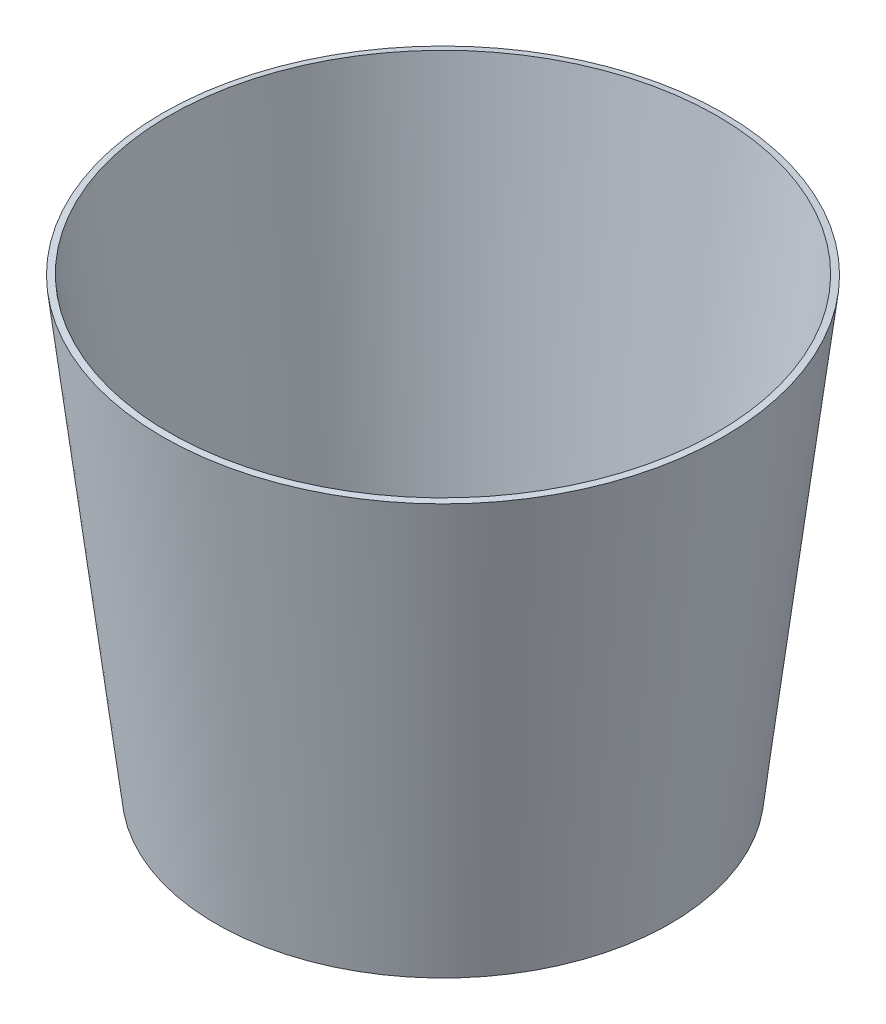
ISO-10303-21;
HEADER;
FILE_DESCRIPTION(('STEP AP214'),'2;1');
FILE_NAME('part.step','',(''),(''),'','','');
FILE_SCHEMA(('AUTOMOTIVE_DESIGN { 1 0 10303 214 1 1 1 1 }'));
ENDSEC;
DATA;
#1=APPLICATION_CONTEXT('core data for automotive mechanical design processes');
#2=APPLICATION_PROTOCOL_DEFINITION('international standard','automotive_design',2000,#1);
#3=PRODUCT_CONTEXT('',#1,'mechanical');
#4=PRODUCT('Part','Part','',(#3));
#5=PRODUCT_RELATED_PRODUCT_CATEGORY('part','',(#4));
#6=PRODUCT_DEFINITION_FORMATION('','',#4);
#7=PRODUCT_DEFINITION_CONTEXT('part definition',#1,'design');
#8=PRODUCT_DEFINITION('design','',#6,#7);
#9=PRODUCT_DEFINITION_SHAPE('','',#8);
#10=(LENGTH_UNIT() NAMED_UNIT(*) SI_UNIT(.MILLI.,.METRE.));
#11=(NAMED_UNIT(*) PLANE_ANGLE_UNIT() SI_UNIT($,.RADIAN.));
#12=(NAMED_UNIT(*) SI_UNIT($,.STERADIAN.) SOLID_ANGLE_UNIT());
#13=UNCERTAINTY_MEASURE_WITH_UNIT(LENGTH_MEASURE(1.E-05),#10,'distance_accuracy_value','');
#14=(GEOMETRIC_REPRESENTATION_CONTEXT(3) GLOBAL_UNCERTAINTY_ASSIGNED_CONTEXT((#13)) GLOBAL_UNIT_ASSIGNED_CONTEXT((#10,
#11,#12)) REPRESENTATION_CONTEXT('',''));
#15=CARTESIAN_POINT('',(0.,0.,0.));
#16=DIRECTION('',(0.,0.,1.));
#17=DIRECTION('',(1.,0.,0.));
#18=AXIS2_PLACEMENT_3D('',#15,#16,#17);
#19=CARTESIAN_POINT('',(0.,3.,0.));
#20=DIRECTION('',(0.,1.,0.));
#21=DIRECTION('',(0.,0.,1.));
#22=AXIS2_PLACEMENT_3D('',#19,#20,#21);
#23=PLANE('',#22);
#24=CARTESIAN_POINT('',(0.,3.,0.));
#25=DIRECTION('',(0.,-1.,0.));
#26=DIRECTION('',(0.,0.,-1.));
#27=AXIS2_PLACEMENT_3D('',#24,#25,#26);
#28=CIRCLE('',#27,105.);
#29=CARTESIAN_POINT('',(0.,3.,-105.));
#30=VERTEX_POINT('',#29);
#31=EDGE_CURVE('E10',#30,#30,#28,.T.);
#32=ORIENTED_EDGE('',*,*,#31,.F.);
#33=EDGE_LOOP('',(#32));
#34=FACE_BOUND('',#33,.T.);
#35=ADVANCED_FACE('F31',(#34),#23,.T.);
#36=CARTESIAN_POINT('',(0.,213.,0.));
#37=DIRECTION('',(0.,1.,0.));
#38=DIRECTION('',(0.,0.,1.));
#39=AXIS2_PLACEMENT_3D('',#36,#37,#38);
#40=CONICAL_SURFACE('',#39,130.,0.118489959158138);
#41=ORIENTED_EDGE('',*,*,#31,.T.);
#42=EDGE_LOOP('',(#41));
#43=FACE_BOUND('',#42,.T.);
#44=CARTESIAN_POINT('',(0.,213.,0.));
#45=DIRECTION('',(0.,-1.,0.));
#46=DIRECTION('',(0.,0.,-1.));
#47=AXIS2_PLACEMENT_3D('',#44,#45,#46);
#48=CIRCLE('',#47,130.);
#49=CARTESIAN_POINT('',(0.,213.,-130.));
#50=VERTEX_POINT('',#49);
#51=EDGE_CURVE('E37',#50,#50,#48,.T.);
#52=ORIENTED_EDGE('',*,*,#51,.F.);
#53=EDGE_LOOP('',(#52));
#54=FACE_BOUND('',#53,.T.);
#55=ADVANCED_FACE('F63',(#43,#54),#40,.F.);
#56=CARTESIAN_POINT('',(0.,212.645361330645,0.));
#57=DIRECTION('',(0.,-1.,0.));
#58=DIRECTION('',(0.,0.,-1.));
#59=AXIS2_PLACEMENT_3D('',#56,#57,#58);
#60=CONICAL_SURFACE('',#59,132.978964822585,1.45230636763676);
#61=ORIENTED_EDGE('',*,*,#51,.T.);
#62=EDGE_LOOP('',(#61));
#63=FACE_BOUND('',#62,.T.);
#64=CARTESIAN_POINT('',(0.,212.645361330645,0.));
#65=DIRECTION('',(0.,-1.,0.));
#66=DIRECTION('',(0.,0.,-1.));
#67=AXIS2_PLACEMENT_3D('',#64,#65,#66);
#68=CIRCLE('',#67,132.978964822585);
#69=CARTESIAN_POINT('',(0.,212.645361330645,-132.978964822585));
#70=VERTEX_POINT('',#69);
#71=EDGE_CURVE('E41',#70,#70,#68,.T.);
#72=ORIENTED_EDGE('',*,*,#71,.F.);
#73=EDGE_LOOP('',(#72));
#74=FACE_BOUND('',#73,.T.);
#75=ADVANCED_FACE('F55',(#63,#74),#60,.T.);
#76=CARTESIAN_POINT('',(0.,0.,0.));
#77=DIRECTION('',(0.,1.,0.));
#78=DIRECTION('',(0.,0.,1.));
#79=AXIS2_PLACEMENT_3D('',#76,#77,#78);
#80=CONICAL_SURFACE('',#79,107.664040854651,0.118489959158137);
#81=ORIENTED_EDGE('',*,*,#71,.T.);
#82=EDGE_LOOP('',(#81));
#83=FACE_BOUND('',#82,.T.);
#84=CARTESIAN_POINT('',(0.,0.,0.));
#85=DIRECTION('',(0.,-1.,0.));
#86=DIRECTION('',(0.,0.,-1.));
#87=AXIS2_PLACEMENT_3D('',#84,#85,#86);
#88=CIRCLE('',#87,107.664040854651);
#89=CARTESIAN_POINT('',(0.,0.,-107.664040854651));
#90=VERTEX_POINT('',#89);
#91=EDGE_CURVE('E45',#90,#90,#88,.T.);
#92=ORIENTED_EDGE('',*,*,#91,.F.);
#93=EDGE_LOOP('',(#92));
#94=FACE_BOUND('',#93,.T.);
#95=ADVANCED_FACE('F53',(#83,#94),#80,.T.);
#96=CARTESIAN_POINT('',(0.,0.,0.));
#97=DIRECTION('',(0.,-1.,0.));
#98=DIRECTION('',(0.,0.,-1.));
#99=AXIS2_PLACEMENT_3D('',#96,#97,#98);
#100=PLANE('',#99);
#101=ORIENTED_EDGE('',*,*,#91,.T.);
#102=EDGE_LOOP('',(#101));
#103=FACE_BOUND('',#102,.T.);
#104=ADVANCED_FACE('F51',(#103),#100,.T.);
#105=CLOSED_SHELL('',(#35,#55,#75,#95,#104));
#106=MANIFOLD_SOLID_BREP('B2',#105);
#107=ADVANCED_BREP_SHAPE_REPRESENTATION('',(#18,#106),#14);
#108=SHAPE_DEFINITION_REPRESENTATION(#9,#107);
ENDSEC;
END-ISO-10303-21;
